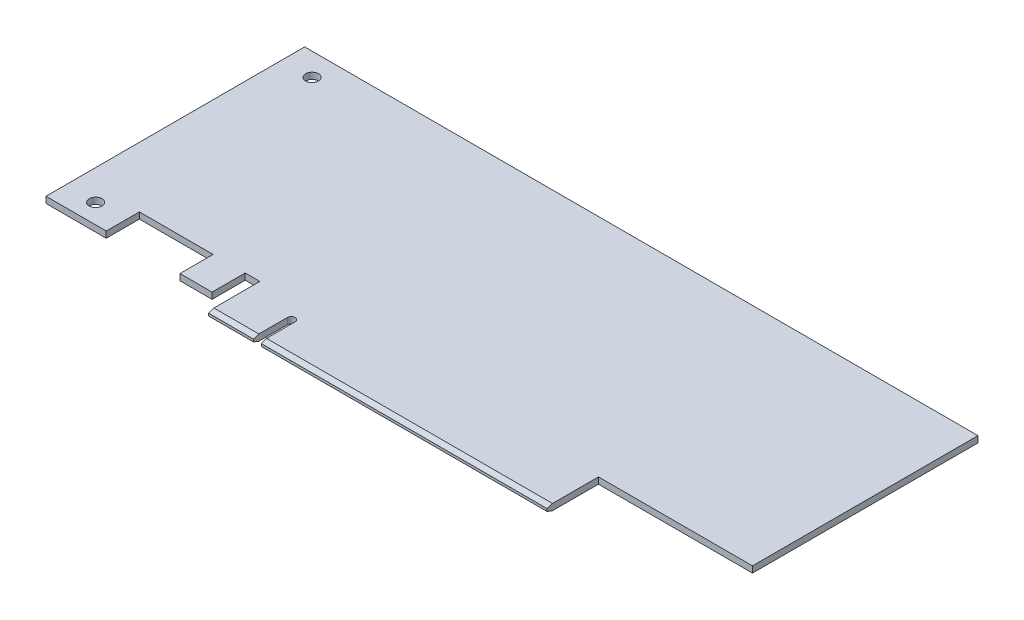
ISO-10303-21;
HEADER;
FILE_DESCRIPTION(('STEP AP214'),'2;1');
FILE_NAME('part.step','',(''),(''),'','','');
FILE_SCHEMA(('AUTOMOTIVE_DESIGN { 1 0 10303 214 1 1 1 1 }'));
ENDSEC;
DATA;
#1=APPLICATION_CONTEXT('core data for automotive mechanical design processes');
#2=APPLICATION_PROTOCOL_DEFINITION('international standard','automotive_design',2000,#1);
#3=PRODUCT_CONTEXT('',#1,'mechanical');
#4=PRODUCT('Part','Part','',(#3));
#5=PRODUCT_RELATED_PRODUCT_CATEGORY('part','',(#4));
#6=PRODUCT_DEFINITION_FORMATION('','',#4);
#7=PRODUCT_DEFINITION_CONTEXT('part definition',#1,'design');
#8=PRODUCT_DEFINITION('design','',#6,#7);
#9=PRODUCT_DEFINITION_SHAPE('','',#8);
#10=(LENGTH_UNIT() NAMED_UNIT(*) SI_UNIT(.MILLI.,.METRE.));
#11=(NAMED_UNIT(*) PLANE_ANGLE_UNIT() SI_UNIT($,.RADIAN.));
#12=(NAMED_UNIT(*) SI_UNIT($,.STERADIAN.) SOLID_ANGLE_UNIT());
#13=UNCERTAINTY_MEASURE_WITH_UNIT(LENGTH_MEASURE(1.E-05),#10,'distance_accuracy_value','');
#14=(GEOMETRIC_REPRESENTATION_CONTEXT(3) GLOBAL_UNCERTAINTY_ASSIGNED_CONTEXT((#13)) GLOBAL_UNIT_ASSIGNED_CONTEXT((#10,
#11,#12)) REPRESENTATION_CONTEXT('',''));
#15=CARTESIAN_POINT('',(0.,0.,0.));
#16=DIRECTION('',(0.,0.,1.));
#17=DIRECTION('',(1.,0.,0.));
#18=AXIS2_PLACEMENT_3D('',#15,#16,#17);
#19=CARTESIAN_POINT('',(50.6,1.57,0.));
#20=DIRECTION('',(1.,0.,0.));
#21=DIRECTION('',(0.,0.,-1.));
#22=AXIS2_PLACEMENT_3D('',#19,#20,#21);
#23=PLANE('',#22);
#24=DIRECTION('',(0.,-0.342020143325663,0.939692620785911));
#25=VECTOR('',#24,1.);
#26=CARTESIAN_POINT('',(50.6,4.15722012898828,0.941671116446083));
#27=LINE('',#26,#25);
#28=CARTESIAN_POINT('',(50.6,1.57,8.05));
#29=VERTEX_POINT('',#28);
#30=CARTESIAN_POINT('',(50.6,1.09683869545395,9.35));
#31=VERTEX_POINT('',#30);
#32=EDGE_CURVE('E195',#29,#31,#27,.T.);
#33=ORIENTED_EDGE('',*,*,#32,.F.);
#34=DIRECTION('',(0.,0.,1.));
#35=VECTOR('',#34,1.);
#36=CARTESIAN_POINT('',(50.6,1.57,0.));
#37=LINE('',#36,#35);
#38=CARTESIAN_POINT('',(50.6,1.57,0.950000000000001));
#39=VERTEX_POINT('',#38);
#40=EDGE_CURVE('E246',#39,#29,#37,.T.);
#41=ORIENTED_EDGE('',*,*,#40,.F.);
#42=DIRECTION('',(0.,-1.,0.));
#43=VECTOR('',#42,1.);
#44=CARTESIAN_POINT('',(50.6,1.57,0.950000000000001));
#45=LINE('',#44,#43);
#46=CARTESIAN_POINT('',(50.6,0.,0.950000000000001));
#47=VERTEX_POINT('',#46);
#48=EDGE_CURVE('E223',#39,#47,#45,.T.);
#49=ORIENTED_EDGE('',*,*,#48,.T.);
#50=DIRECTION('',(0.,0.,1.));
#51=VECTOR('',#50,1.);
#52=CARTESIAN_POINT('',(50.6,0.,0.));
#53=LINE('',#52,#51);
#54=CARTESIAN_POINT('',(50.6,0.,8.05));
#55=VERTEX_POINT('',#54);
#56=EDGE_CURVE('E256',#47,#55,#53,.T.);
#57=ORIENTED_EDGE('',*,*,#56,.T.);
#58=DIRECTION('',(0.,-0.342020143325663,-0.939692620785911));
#59=VECTOR('',#58,1.);
#60=CARTESIAN_POINT('',(50.6,-2.40356501683669,1.44625939005001));
#61=LINE('',#60,#59);
#62=CARTESIAN_POINT('',(50.6,0.473161304546053,9.35));
#63=VERTEX_POINT('',#62);
#64=EDGE_CURVE('E510',#63,#55,#61,.T.);
#65=ORIENTED_EDGE('',*,*,#64,.F.);
#66=DIRECTION('',(0.,-1.,0.));
#67=VECTOR('',#66,1.);
#68=CARTESIAN_POINT('',(50.6,1.57,9.35));
#69=LINE('',#68,#67);
#70=EDGE_CURVE('E218',#31,#63,#69,.T.);
#71=ORIENTED_EDGE('',*,*,#70,.F.);
#72=EDGE_LOOP('',(#33,#41,#49,#57,#65,#71));
#73=FACE_BOUND('',#72,.T.);
#74=ADVANCED_FACE('F45',(#73),#23,.F.);
#75=CARTESIAN_POINT('',(0.,1.57,9.35));
#76=DIRECTION('',(0.,0.,-1.));
#77=DIRECTION('',(-1.,0.,0.));
#78=AXIS2_PLACEMENT_3D('',#75,#76,#77);
#79=PLANE('',#78);
#80=DIRECTION('',(1.,0.,0.));
#81=VECTOR('',#80,1.);
#82=CARTESIAN_POINT('',(37.23,1.09683869545395,9.35));
#83=LINE('',#82,#81);
#84=CARTESIAN_POINT('',(121.8,1.09683869545395,9.35));
#85=VERTEX_POINT('',#84);
#86=EDGE_CURVE('E192',#31,#85,#83,.T.);
#87=ORIENTED_EDGE('',*,*,#86,.F.);
#88=ORIENTED_EDGE('',*,*,#70,.T.);
#89=DIRECTION('',(1.,0.,0.));
#90=VECTOR('',#89,1.);
#91=CARTESIAN_POINT('',(37.23,0.473161304546053,9.35));
#92=LINE('',#91,#90);
#93=CARTESIAN_POINT('',(121.8,0.473161304546053,9.35));
#94=VERTEX_POINT('',#93);
#95=EDGE_CURVE('E216',#63,#94,#92,.T.);
#96=ORIENTED_EDGE('',*,*,#95,.T.);
#97=DIRECTION('',(0.,-1.,0.));
#98=VECTOR('',#97,1.);
#99=CARTESIAN_POINT('',(121.8,1.57,9.35));
#100=LINE('',#99,#98);
#101=EDGE_CURVE('E208',#85,#94,#100,.T.);
#102=ORIENTED_EDGE('',*,*,#101,.F.);
#103=EDGE_LOOP('',(#87,#88,#96,#102));
#104=FACE_BOUND('',#103,.T.);
#105=ADVANCED_FACE('F215',(#104),#79,.F.);
#106=CARTESIAN_POINT('',(121.8,1.57,0.));
#107=DIRECTION('',(1.,0.,0.));
#108=DIRECTION('',(0.,0.,-1.));
#109=AXIS2_PLACEMENT_3D('',#106,#107,#108);
#110=PLANE('',#109);
#111=DIRECTION('',(0.,0.,1.));
#112=VECTOR('',#111,1.);
#113=CARTESIAN_POINT('',(121.8,1.57,0.));
#114=LINE('',#113,#112);
#115=CARTESIAN_POINT('',(121.8,1.57,-3.4));
#116=VERTEX_POINT('',#115);
#117=CARTESIAN_POINT('',(121.8,1.57,8.05));
#118=VERTEX_POINT('',#117);
#119=EDGE_CURVE('E210',#116,#118,#114,.T.);
#120=ORIENTED_EDGE('',*,*,#119,.T.);
#121=DIRECTION('',(0.,-0.342020143325663,0.939692620785911));
#122=VECTOR('',#121,1.);
#123=CARTESIAN_POINT('',(121.8,3.97356501683669,1.44625939005001));
#124=LINE('',#123,#122);
#125=EDGE_CURVE('E68',#118,#85,#124,.T.);
#126=ORIENTED_EDGE('',*,*,#125,.T.);
#127=ORIENTED_EDGE('',*,*,#101,.T.);
#128=DIRECTION('',(0.,-0.342020143325663,-0.939692620785911));
#129=VECTOR('',#128,1.);
#130=CARTESIAN_POINT('',(121.8,-2.58722012898828,0.941671116446081));
#131=LINE('',#130,#129);
#132=CARTESIAN_POINT('',(121.8,0.,8.05));
#133=VERTEX_POINT('',#132);
#134=EDGE_CURVE('E503',#94,#133,#131,.T.);
#135=ORIENTED_EDGE('',*,*,#134,.T.);
#136=DIRECTION('',(0.,0.,1.));
#137=VECTOR('',#136,1.);
#138=CARTESIAN_POINT('',(121.8,0.,0.));
#139=LINE('',#138,#137);
#140=CARTESIAN_POINT('',(121.8,0.,-3.4));
#141=VERTEX_POINT('',#140);
#142=EDGE_CURVE('E328',#141,#133,#139,.T.);
#143=ORIENTED_EDGE('',*,*,#142,.F.);
#144=DIRECTION('',(0.,-1.,0.));
#145=VECTOR('',#144,1.);
#146=CARTESIAN_POINT('',(121.8,1.57,-3.4));
#147=LINE('',#146,#145);
#148=EDGE_CURVE('E219',#116,#141,#147,.T.);
#149=ORIENTED_EDGE('',*,*,#148,.F.);
#150=EDGE_LOOP('',(#120,#126,#127,#135,#143,#149));
#151=FACE_BOUND('',#150,.T.);
#152=ADVANCED_FACE('F206',(#151),#110,.T.);
#153=CARTESIAN_POINT('',(37.5,1.57,0.));
#154=DIRECTION('',(1.,0.,0.));
#155=DIRECTION('',(0.,0.,-1.));
#156=AXIS2_PLACEMENT_3D('',#153,#154,#155);
#157=PLANE('',#156);
#158=DIRECTION('',(0.,-0.342020143325663,0.939692620785911));
#159=VECTOR('',#158,1.);
#160=CARTESIAN_POINT('',(37.5,4.15722012898828,0.941671116446083));
#161=LINE('',#160,#159);
#162=CARTESIAN_POINT('',(37.5,1.57,8.05));
#163=VERTEX_POINT('',#162);
#164=CARTESIAN_POINT('',(37.5,1.09683869545395,9.35));
#165=VERTEX_POINT('',#164);
#166=EDGE_CURVE('E251',#163,#165,#161,.T.);
#167=ORIENTED_EDGE('',*,*,#166,.F.);
#168=DIRECTION('',(0.,0.,1.));
#169=VECTOR('',#168,1.);
#170=CARTESIAN_POINT('',(37.5,1.57,0.));
#171=LINE('',#170,#169);
#172=CARTESIAN_POINT('',(37.5,1.57,-3.4));
#173=VERTEX_POINT('',#172);
#174=EDGE_CURVE('E309',#173,#163,#171,.T.);
#175=ORIENTED_EDGE('',*,*,#174,.F.);
#176=DIRECTION('',(0.,-1.,0.));
#177=VECTOR('',#176,1.);
#178=CARTESIAN_POINT('',(37.5,1.57,-3.4));
#179=LINE('',#178,#177);
#180=CARTESIAN_POINT('',(37.5,0.,-3.4));
#181=VERTEX_POINT('',#180);
#182=EDGE_CURVE('E399',#173,#181,#179,.T.);
#183=ORIENTED_EDGE('',*,*,#182,.T.);
#184=DIRECTION('',(0.,0.,1.));
#185=VECTOR('',#184,1.);
#186=CARTESIAN_POINT('',(37.5,0.,0.));
#187=LINE('',#186,#185);
#188=CARTESIAN_POINT('',(37.5,0.,8.05));
#189=VERTEX_POINT('',#188);
#190=EDGE_CURVE('E374',#181,#189,#187,.T.);
#191=ORIENTED_EDGE('',*,*,#190,.T.);
#192=DIRECTION('',(0.,-0.342020143325663,-0.939692620785911));
#193=VECTOR('',#192,1.);
#194=CARTESIAN_POINT('',(37.5,-2.40356501683669,1.44625939005001));
#195=LINE('',#194,#193);
#196=CARTESIAN_POINT('',(37.5,0.473161304546053,9.35));
#197=VERTEX_POINT('',#196);
#198=EDGE_CURVE('E500',#197,#189,#195,.T.);
#199=ORIENTED_EDGE('',*,*,#198,.F.);
#200=DIRECTION('',(0.,-1.,0.));
#201=VECTOR('',#200,1.);
#202=CARTESIAN_POINT('',(37.5,1.57,9.35));
#203=LINE('',#202,#201);
#204=EDGE_CURVE('E395',#165,#197,#203,.T.);
#205=ORIENTED_EDGE('',*,*,#204,.F.);
#206=EDGE_LOOP('',(#167,#175,#183,#191,#199,#205));
#207=FACE_BOUND('',#206,.T.);
#208=ADVANCED_FACE('F487',(#207),#157,.F.);
#209=CARTESIAN_POINT('',(0.,1.57,9.35));
#210=DIRECTION('',(0.,0.,-1.));
#211=DIRECTION('',(-1.,0.,0.));
#212=AXIS2_PLACEMENT_3D('',#209,#210,#211);
#213=PLANE('',#212);
#214=CARTESIAN_POINT('',(48.7,1.09683869545395,9.35));
#215=VERTEX_POINT('',#214);
#216=EDGE_CURVE('E201',#165,#215,#83,.T.);
#217=ORIENTED_EDGE('',*,*,#216,.F.);
#218=ORIENTED_EDGE('',*,*,#204,.T.);
#219=CARTESIAN_POINT('',(48.7,0.473161304546053,9.35));
#220=VERTEX_POINT('',#219);
#221=EDGE_CURVE('E212',#197,#220,#92,.T.);
#222=ORIENTED_EDGE('',*,*,#221,.T.);
#223=DIRECTION('',(0.,-1.,0.));
#224=VECTOR('',#223,1.);
#225=CARTESIAN_POINT('',(48.7,1.57,9.35));
#226=LINE('',#225,#224);
#227=EDGE_CURVE('E391',#215,#220,#226,.T.);
#228=ORIENTED_EDGE('',*,*,#227,.F.);
#229=EDGE_LOOP('',(#217,#218,#222,#228));
#230=FACE_BOUND('',#229,.T.);
#231=ADVANCED_FACE('F495',(#230),#213,.F.);
#232=CARTESIAN_POINT('',(48.7,1.57,0.));
#233=DIRECTION('',(1.,0.,0.));
#234=DIRECTION('',(0.,0.,-1.));
#235=AXIS2_PLACEMENT_3D('',#232,#233,#234);
#236=PLANE('',#235);
#237=DIRECTION('',(0.,0.,1.));
#238=VECTOR('',#237,1.);
#239=CARTESIAN_POINT('',(48.7,1.57,0.));
#240=LINE('',#239,#238);
#241=CARTESIAN_POINT('',(48.7,1.57,0.949999999999999));
#242=VERTEX_POINT('',#241);
#243=CARTESIAN_POINT('',(48.7,1.57,8.05));
#244=VERTEX_POINT('',#243);
#245=EDGE_CURVE('E312',#242,#244,#240,.T.);
#246=ORIENTED_EDGE('',*,*,#245,.T.);
#247=DIRECTION('',(0.,-0.342020143325663,0.939692620785911));
#248=VECTOR('',#247,1.);
#249=CARTESIAN_POINT('',(48.7,4.15722012898828,0.941671116446083));
#250=LINE('',#249,#248);
#251=EDGE_CURVE('E61',#244,#215,#250,.T.);
#252=ORIENTED_EDGE('',*,*,#251,.T.);
#253=ORIENTED_EDGE('',*,*,#227,.T.);
#254=DIRECTION('',(0.,-0.342020143325663,-0.939692620785911));
#255=VECTOR('',#254,1.);
#256=CARTESIAN_POINT('',(48.7,-2.40356501683669,1.44625939005001));
#257=LINE('',#256,#255);
#258=CARTESIAN_POINT('',(48.7,0.,8.05));
#259=VERTEX_POINT('',#258);
#260=EDGE_CURVE('E498',#220,#259,#257,.T.);
#261=ORIENTED_EDGE('',*,*,#260,.T.);
#262=DIRECTION('',(0.,0.,1.));
#263=VECTOR('',#262,1.);
#264=CARTESIAN_POINT('',(48.7,0.,0.));
#265=LINE('',#264,#263);
#266=CARTESIAN_POINT('',(48.7,0.,0.949999999999999));
#267=VERTEX_POINT('',#266);
#268=EDGE_CURVE('E378',#267,#259,#265,.T.);
#269=ORIENTED_EDGE('',*,*,#268,.F.);
#270=DIRECTION('',(0.,-1.,0.));
#271=VECTOR('',#270,1.);
#272=CARTESIAN_POINT('',(48.7,1.57,0.949999999999999));
#273=LINE('',#272,#271);
#274=EDGE_CURVE('E323',#242,#267,#273,.T.);
#275=ORIENTED_EDGE('',*,*,#274,.F.);
#276=EDGE_LOOP('',(#246,#252,#253,#261,#269,#275));
#277=FACE_BOUND('',#276,.T.);
#278=ADVANCED_FACE('F514',(#277),#236,.T.);
#279=CARTESIAN_POINT('',(0.,1.57,0.));
#280=DIRECTION('',(0.,1.,0.));
#281=DIRECTION('',(0.,0.,1.));
#282=AXIS2_PLACEMENT_3D('',#279,#280,#281);
#283=PLANE('',#282);
#284=CARTESIAN_POINT('',(0.,1.57,-53.9));
#285=DIRECTION('',(0.,1.,0.));
#286=DIRECTION('',(0.,0.,1.));
#287=AXIS2_PLACEMENT_3D('',#284,#285,#286);
#288=CIRCLE('',#287,1.59);
#289=CARTESIAN_POINT('',(0.,1.57,-52.31));
#290=VERTEX_POINT('',#289);
#291=EDGE_CURVE('E316',#290,#290,#288,.T.);
#292=ORIENTED_EDGE('',*,*,#291,.F.);
#293=EDGE_LOOP('',(#292));
#294=FACE_BOUND('',#293,.T.);
#295=CARTESIAN_POINT('',(0.,1.57,0.));
#296=DIRECTION('',(0.,1.,0.));
#297=DIRECTION('',(0.,0.,1.));
#298=AXIS2_PLACEMENT_3D('',#295,#296,#297);
#299=CIRCLE('',#298,1.59);
#300=CARTESIAN_POINT('',(0.,1.57,1.59));
#301=VERTEX_POINT('',#300);
#302=EDGE_CURVE('E320',#301,#301,#299,.T.);
#303=ORIENTED_EDGE('',*,*,#302,.F.);
#304=EDGE_LOOP('',(#303));
#305=FACE_BOUND('',#304,.T.);
#306=ORIENTED_EDGE('',*,*,#174,.T.);
#307=DIRECTION('',(1.,0.,0.));
#308=VECTOR('',#307,1.);
#309=CARTESIAN_POINT('',(0.,1.57,8.05));
#310=LINE('',#309,#308);
#311=EDGE_CURVE('E12',#163,#244,#310,.T.);
#312=ORIENTED_EDGE('',*,*,#311,.T.);
#313=ORIENTED_EDGE('',*,*,#245,.F.);
#314=CARTESIAN_POINT('',(49.65,1.57,0.95));
#315=DIRECTION('',(0.,1.,0.));
#316=DIRECTION('',(0.,0.,1.));
#317=AXIS2_PLACEMENT_3D('',#314,#315,#316);
#318=CIRCLE('',#317,0.95);
#319=EDGE_CURVE('E261',#39,#242,#318,.T.);
#320=ORIENTED_EDGE('',*,*,#319,.F.);
#321=ORIENTED_EDGE('',*,*,#40,.T.);
#322=EDGE_CURVE('E49',#29,#118,#310,.T.);
#323=ORIENTED_EDGE('',*,*,#322,.T.);
#324=ORIENTED_EDGE('',*,*,#119,.F.);
#325=DIRECTION('',(1.,0.,0.));
#326=VECTOR('',#325,1.);
#327=CARTESIAN_POINT('',(0.,1.57,-3.4));
#328=LINE('',#327,#326);
#329=CARTESIAN_POINT('',(160.15,1.57,-3.4));
#330=VERTEX_POINT('',#329);
#331=EDGE_CURVE('E270',#116,#330,#328,.T.);
#332=ORIENTED_EDGE('',*,*,#331,.T.);
#333=DIRECTION('',(0.,0.,1.));
#334=VECTOR('',#333,1.);
#335=CARTESIAN_POINT('',(160.15,1.57,0.));
#336=LINE('',#335,#334);
#337=CARTESIAN_POINT('',(160.15,1.57,-59.55));
#338=VERTEX_POINT('',#337);
#339=EDGE_CURVE('E273',#338,#330,#336,.T.);
#340=ORIENTED_EDGE('',*,*,#339,.F.);
#341=DIRECTION('',(1.,0.,0.));
#342=VECTOR('',#341,1.);
#343=CARTESIAN_POINT('',(0.,1.57,-59.55));
#344=LINE('',#343,#342);
#345=CARTESIAN_POINT('',(-7.5,1.57,-59.55));
#346=VERTEX_POINT('',#345);
#347=EDGE_CURVE('E277',#346,#338,#344,.T.);
#348=ORIENTED_EDGE('',*,*,#347,.F.);
#349=DIRECTION('',(0.,0.,1.));
#350=VECTOR('',#349,1.);
#351=CARTESIAN_POINT('',(-7.49999999999999,1.57,0.));
#352=LINE('',#351,#350);
#353=CARTESIAN_POINT('',(-7.5,1.57,4.85));
#354=VERTEX_POINT('',#353);
#355=EDGE_CURVE('E281',#346,#354,#352,.T.);
#356=ORIENTED_EDGE('',*,*,#355,.T.);
#357=DIRECTION('',(1.,0.,0.));
#358=VECTOR('',#357,1.);
#359=CARTESIAN_POINT('',(0.,1.57,4.85));
#360=LINE('',#359,#358);
#361=CARTESIAN_POINT('',(7.5,1.57,4.85));
#362=VERTEX_POINT('',#361);
#363=EDGE_CURVE('E284',#354,#362,#360,.T.);
#364=ORIENTED_EDGE('',*,*,#363,.T.);
#365=DIRECTION('',(0.,0.,1.));
#366=VECTOR('',#365,1.);
#367=CARTESIAN_POINT('',(7.5,1.57,0.));
#368=LINE('',#367,#366);
#369=CARTESIAN_POINT('',(7.5,1.57,-3.4));
#370=VERTEX_POINT('',#369);
#371=EDGE_CURVE('E287',#370,#362,#368,.T.);
#372=ORIENTED_EDGE('',*,*,#371,.F.);
#373=DIRECTION('',(-1.,0.,0.));
#374=VECTOR('',#373,1.);
#375=CARTESIAN_POINT('',(0.,1.57,-3.4));
#376=LINE('',#375,#374);
#377=CARTESIAN_POINT('',(25.85,1.57,-3.4));
#378=VERTEX_POINT('',#377);
#379=EDGE_CURVE('E291',#378,#370,#376,.T.);
#380=ORIENTED_EDGE('',*,*,#379,.F.);
#381=DIRECTION('',(0.,0.,-1.));
#382=VECTOR('',#381,1.);
#383=CARTESIAN_POINT('',(25.85,1.57,0.));
#384=LINE('',#383,#382);
#385=CARTESIAN_POINT('',(25.85,1.57,4.85));
#386=VERTEX_POINT('',#385);
#387=EDGE_CURVE('E295',#386,#378,#384,.T.);
#388=ORIENTED_EDGE('',*,*,#387,.F.);
#389=DIRECTION('',(1.,0.,0.));
#390=VECTOR('',#389,1.);
#391=CARTESIAN_POINT('',(0.,1.57,4.85));
#392=LINE('',#391,#390);
#393=CARTESIAN_POINT('',(33.85,1.57,4.85));
#394=VERTEX_POINT('',#393);
#395=EDGE_CURVE('E299',#386,#394,#392,.T.);
#396=ORIENTED_EDGE('',*,*,#395,.T.);
#397=DIRECTION('',(0.,0.,-1.));
#398=VECTOR('',#397,1.);
#399=CARTESIAN_POINT('',(33.85,1.57,0.));
#400=LINE('',#399,#398);
#401=CARTESIAN_POINT('',(33.85,1.57,-3.4));
#402=VERTEX_POINT('',#401);
#403=EDGE_CURVE('E302',#394,#402,#400,.T.);
#404=ORIENTED_EDGE('',*,*,#403,.T.);
#405=DIRECTION('',(-1.,0.,0.));
#406=VECTOR('',#405,1.);
#407=CARTESIAN_POINT('',(0.,1.57,-3.4));
#408=LINE('',#407,#406);
#409=EDGE_CURVE('E305',#173,#402,#408,.T.);
#410=ORIENTED_EDGE('',*,*,#409,.F.);
#411=EDGE_LOOP('',(#306,#312,#313,#320,#321,#323,#324,#332,#340,#348,#356,#364,#372,#380,#388,
#396,#404,#410));
#412=FACE_BOUND('',#411,.T.);
#413=ADVANCED_FACE('F243',(#294,#305,#412),#283,.T.);
#414=CARTESIAN_POINT('',(0.,0.,0.));
#415=DIRECTION('',(0.,1.,0.));
#416=DIRECTION('',(0.,0.,1.));
#417=AXIS2_PLACEMENT_3D('',#414,#415,#416);
#418=PLANE('',#417);
#419=CARTESIAN_POINT('',(0.,0.,-53.9));
#420=DIRECTION('',(0.,1.,0.));
#421=DIRECTION('',(0.,0.,1.));
#422=AXIS2_PLACEMENT_3D('',#419,#420,#421);
#423=CIRCLE('',#422,1.59);
#424=CARTESIAN_POINT('',(0.,0.,-52.31));
#425=VERTEX_POINT('',#424);
#426=EDGE_CURVE('E382',#425,#425,#423,.T.);
#427=ORIENTED_EDGE('',*,*,#426,.T.);
#428=EDGE_LOOP('',(#427));
#429=FACE_BOUND('',#428,.T.);
#430=CARTESIAN_POINT('',(0.,0.,0.));
#431=DIRECTION('',(0.,1.,0.));
#432=DIRECTION('',(0.,0.,1.));
#433=AXIS2_PLACEMENT_3D('',#430,#431,#432);
#434=CIRCLE('',#433,1.59);
#435=CARTESIAN_POINT('',(0.,0.,1.59));
#436=VERTEX_POINT('',#435);
#437=EDGE_CURVE('E265',#436,#436,#434,.T.);
#438=ORIENTED_EDGE('',*,*,#437,.T.);
#439=EDGE_LOOP('',(#438));
#440=FACE_BOUND('',#439,.T.);
#441=DIRECTION('',(1.,0.,0.));
#442=VECTOR('',#441,1.);
#443=CARTESIAN_POINT('',(0.,0.,8.05));
#444=LINE('',#443,#442);
#445=EDGE_CURVE('E232',#189,#259,#444,.T.);
#446=ORIENTED_EDGE('',*,*,#445,.F.);
#447=ORIENTED_EDGE('',*,*,#190,.F.);
#448=DIRECTION('',(-1.,0.,0.));
#449=VECTOR('',#448,1.);
#450=CARTESIAN_POINT('',(0.,0.,-3.4));
#451=LINE('',#450,#449);
#452=CARTESIAN_POINT('',(33.85,0.,-3.4));
#453=VERTEX_POINT('',#452);
#454=EDGE_CURVE('E370',#181,#453,#451,.T.);
#455=ORIENTED_EDGE('',*,*,#454,.T.);
#456=DIRECTION('',(0.,0.,-1.));
#457=VECTOR('',#456,1.);
#458=CARTESIAN_POINT('',(33.85,0.,0.));
#459=LINE('',#458,#457);
#460=CARTESIAN_POINT('',(33.85,0.,4.85));
#461=VERTEX_POINT('',#460);
#462=EDGE_CURVE('E366',#461,#453,#459,.T.);
#463=ORIENTED_EDGE('',*,*,#462,.F.);
#464=DIRECTION('',(1.,0.,0.));
#465=VECTOR('',#464,1.);
#466=CARTESIAN_POINT('',(0.,0.,4.85));
#467=LINE('',#466,#465);
#468=CARTESIAN_POINT('',(25.85,0.,4.85));
#469=VERTEX_POINT('',#468);
#470=EDGE_CURVE('E363',#469,#461,#467,.T.);
#471=ORIENTED_EDGE('',*,*,#470,.F.);
#472=DIRECTION('',(0.,0.,-1.));
#473=VECTOR('',#472,1.);
#474=CARTESIAN_POINT('',(25.85,0.,0.));
#475=LINE('',#474,#473);
#476=CARTESIAN_POINT('',(25.85,0.,-3.4));
#477=VERTEX_POINT('',#476);
#478=EDGE_CURVE('E359',#469,#477,#475,.T.);
#479=ORIENTED_EDGE('',*,*,#478,.T.);
#480=DIRECTION('',(-1.,0.,0.));
#481=VECTOR('',#480,1.);
#482=CARTESIAN_POINT('',(0.,0.,-3.4));
#483=LINE('',#482,#481);
#484=CARTESIAN_POINT('',(7.5,0.,-3.4));
#485=VERTEX_POINT('',#484);
#486=EDGE_CURVE('E355',#477,#485,#483,.T.);
#487=ORIENTED_EDGE('',*,*,#486,.T.);
#488=DIRECTION('',(0.,0.,1.));
#489=VECTOR('',#488,1.);
#490=CARTESIAN_POINT('',(7.5,0.,0.));
#491=LINE('',#490,#489);
#492=CARTESIAN_POINT('',(7.5,0.,4.85));
#493=VERTEX_POINT('',#492);
#494=EDGE_CURVE('E351',#485,#493,#491,.T.);
#495=ORIENTED_EDGE('',*,*,#494,.T.);
#496=DIRECTION('',(1.,0.,0.));
#497=VECTOR('',#496,1.);
#498=CARTESIAN_POINT('',(0.,0.,4.85));
#499=LINE('',#498,#497);
#500=CARTESIAN_POINT('',(-7.5,0.,4.85));
#501=VERTEX_POINT('',#500);
#502=EDGE_CURVE('E347',#501,#493,#499,.T.);
#503=ORIENTED_EDGE('',*,*,#502,.F.);
#504=DIRECTION('',(0.,0.,1.));
#505=VECTOR('',#504,1.);
#506=CARTESIAN_POINT('',(-7.49999999999999,0.,0.));
#507=LINE('',#506,#505);
#508=CARTESIAN_POINT('',(-7.5,0.,-59.55));
#509=VERTEX_POINT('',#508);
#510=EDGE_CURVE('E344',#509,#501,#507,.T.);
#511=ORIENTED_EDGE('',*,*,#510,.F.);
#512=DIRECTION('',(1.,0.,0.));
#513=VECTOR('',#512,1.);
#514=CARTESIAN_POINT('',(0.,0.,-59.55));
#515=LINE('',#514,#513);
#516=CARTESIAN_POINT('',(160.15,0.,-59.55));
#517=VERTEX_POINT('',#516);
#518=EDGE_CURVE('E340',#509,#517,#515,.T.);
#519=ORIENTED_EDGE('',*,*,#518,.T.);
#520=DIRECTION('',(0.,0.,1.));
#521=VECTOR('',#520,1.);
#522=CARTESIAN_POINT('',(160.15,0.,0.));
#523=LINE('',#522,#521);
#524=CARTESIAN_POINT('',(160.15,0.,-3.4));
#525=VERTEX_POINT('',#524);
#526=EDGE_CURVE('E336',#517,#525,#523,.T.);
#527=ORIENTED_EDGE('',*,*,#526,.T.);
#528=DIRECTION('',(1.,0.,0.));
#529=VECTOR('',#528,1.);
#530=CARTESIAN_POINT('',(0.,0.,-3.4));
#531=LINE('',#530,#529);
#532=EDGE_CURVE('E332',#141,#525,#531,.T.);
#533=ORIENTED_EDGE('',*,*,#532,.F.);
#534=ORIENTED_EDGE('',*,*,#142,.T.);
#535=EDGE_CURVE('E230',#55,#133,#444,.T.);
#536=ORIENTED_EDGE('',*,*,#535,.F.);
#537=ORIENTED_EDGE('',*,*,#56,.F.);
#538=CARTESIAN_POINT('',(49.65,0.,0.95));
#539=DIRECTION('',(0.,1.,0.));
#540=DIRECTION('',(0.,0.,1.));
#541=AXIS2_PLACEMENT_3D('',#538,#539,#540);
#542=CIRCLE('',#541,0.95);
#543=EDGE_CURVE('E250',#47,#267,#542,.T.);
#544=ORIENTED_EDGE('',*,*,#543,.T.);
#545=ORIENTED_EDGE('',*,*,#268,.T.);
#546=EDGE_LOOP('',(#446,#447,#455,#463,#471,#479,#487,#495,#503,#511,#519,#527,#533,#534,#536,
#537,#544,#545));
#547=FACE_BOUND('',#546,.T.);
#548=ADVANCED_FACE('F442',(#429,#440,#547),#418,.F.);
#549=CARTESIAN_POINT('',(49.65,1.57,0.95));
#550=DIRECTION('',(0.,-1.,0.));
#551=DIRECTION('',(0.,0.,-1.));
#552=AXIS2_PLACEMENT_3D('',#549,#550,#551);
#553=CYLINDRICAL_SURFACE('',#552,0.95);
#554=ORIENTED_EDGE('',*,*,#543,.F.);
#555=ORIENTED_EDGE('',*,*,#48,.F.);
#556=ORIENTED_EDGE('',*,*,#319,.T.);
#557=ORIENTED_EDGE('',*,*,#274,.T.);
#558=EDGE_LOOP('',(#554,#555,#556,#557));
#559=FACE_BOUND('',#558,.T.);
#560=ADVANCED_FACE('F47',(#559),#553,.F.);
#561=CARTESIAN_POINT('',(0.,1.57,-3.4));
#562=DIRECTION('',(0.,0.,-1.));
#563=DIRECTION('',(-1.,0.,0.));
#564=AXIS2_PLACEMENT_3D('',#561,#562,#563);
#565=PLANE('',#564);
#566=ORIENTED_EDGE('',*,*,#532,.T.);
#567=DIRECTION('',(0.,-1.,0.));
#568=VECTOR('',#567,1.);
#569=CARTESIAN_POINT('',(160.15,1.57,-3.4));
#570=LINE('',#569,#568);
#571=EDGE_CURVE('E225',#330,#525,#570,.T.);
#572=ORIENTED_EDGE('',*,*,#571,.F.);
#573=ORIENTED_EDGE('',*,*,#331,.F.);
#574=ORIENTED_EDGE('',*,*,#148,.T.);
#575=EDGE_LOOP('',(#566,#572,#573,#574));
#576=FACE_BOUND('',#575,.T.);
#577=ADVANCED_FACE('F439',(#576),#565,.F.);
#578=CARTESIAN_POINT('',(160.15,1.57,0.));
#579=DIRECTION('',(1.,0.,0.));
#580=DIRECTION('',(0.,0.,-1.));
#581=AXIS2_PLACEMENT_3D('',#578,#579,#580);
#582=PLANE('',#581);
#583=ORIENTED_EDGE('',*,*,#526,.F.);
#584=DIRECTION('',(0.,-1.,0.));
#585=VECTOR('',#584,1.);
#586=CARTESIAN_POINT('',(160.15,1.57,-59.55));
#587=LINE('',#586,#585);
#588=EDGE_CURVE('E428',#338,#517,#587,.T.);
#589=ORIENTED_EDGE('',*,*,#588,.F.);
#590=ORIENTED_EDGE('',*,*,#339,.T.);
#591=ORIENTED_EDGE('',*,*,#571,.T.);
#592=EDGE_LOOP('',(#583,#589,#590,#591));
#593=FACE_BOUND('',#592,.T.);
#594=ADVANCED_FACE('F434',(#593),#582,.T.);
#595=CARTESIAN_POINT('',(0.,1.57,-59.55));
#596=DIRECTION('',(0.,0.,-1.));
#597=DIRECTION('',(-1.,0.,0.));
#598=AXIS2_PLACEMENT_3D('',#595,#596,#597);
#599=PLANE('',#598);
#600=ORIENTED_EDGE('',*,*,#518,.F.);
#601=DIRECTION('',(0.,-1.,0.));
#602=VECTOR('',#601,1.);
#603=CARTESIAN_POINT('',(-7.5,1.57,-59.55));
#604=LINE('',#603,#602);
#605=EDGE_CURVE('E425',#346,#509,#604,.T.);
#606=ORIENTED_EDGE('',*,*,#605,.F.);
#607=ORIENTED_EDGE('',*,*,#347,.T.);
#608=ORIENTED_EDGE('',*,*,#588,.T.);
#609=EDGE_LOOP('',(#600,#606,#607,#608));
#610=FACE_BOUND('',#609,.T.);
#611=ADVANCED_FACE('F447',(#610),#599,.T.);
#612=CARTESIAN_POINT('',(-7.49999999999999,1.57,0.));
#613=DIRECTION('',(1.,0.,0.));
#614=DIRECTION('',(0.,0.,-1.));
#615=AXIS2_PLACEMENT_3D('',#612,#613,#614);
#616=PLANE('',#615);
#617=ORIENTED_EDGE('',*,*,#510,.T.);
#618=DIRECTION('',(0.,-1.,0.));
#619=VECTOR('',#618,1.);
#620=CARTESIAN_POINT('',(-7.5,1.57,4.85));
#621=LINE('',#620,#619);
#622=EDGE_CURVE('E421',#354,#501,#621,.T.);
#623=ORIENTED_EDGE('',*,*,#622,.F.);
#624=ORIENTED_EDGE('',*,*,#355,.F.);
#625=ORIENTED_EDGE('',*,*,#605,.T.);
#626=EDGE_LOOP('',(#617,#623,#624,#625));
#627=FACE_BOUND('',#626,.T.);
#628=ADVANCED_FACE('F455',(#627),#616,.F.);
#629=CARTESIAN_POINT('',(0.,1.57,4.85));
#630=DIRECTION('',(0.,0.,-1.));
#631=DIRECTION('',(-1.,0.,0.));
#632=AXIS2_PLACEMENT_3D('',#629,#630,#631);
#633=PLANE('',#632);
#634=ORIENTED_EDGE('',*,*,#502,.T.);
#635=DIRECTION('',(0.,-1.,0.));
#636=VECTOR('',#635,1.);
#637=CARTESIAN_POINT('',(7.5,1.57,4.85));
#638=LINE('',#637,#636);
#639=EDGE_CURVE('E418',#362,#493,#638,.T.);
#640=ORIENTED_EDGE('',*,*,#639,.F.);
#641=ORIENTED_EDGE('',*,*,#363,.F.);
#642=ORIENTED_EDGE('',*,*,#622,.T.);
#643=EDGE_LOOP('',(#634,#640,#641,#642));
#644=FACE_BOUND('',#643,.T.);
#645=ADVANCED_FACE('F457',(#644),#633,.F.);
#646=CARTESIAN_POINT('',(7.5,1.57,0.));
#647=DIRECTION('',(1.,0.,0.));
#648=DIRECTION('',(0.,0.,-1.));
#649=AXIS2_PLACEMENT_3D('',#646,#647,#648);
#650=PLANE('',#649);
#651=ORIENTED_EDGE('',*,*,#494,.F.);
#652=DIRECTION('',(0.,-1.,0.));
#653=VECTOR('',#652,1.);
#654=CARTESIAN_POINT('',(7.5,1.57,-3.4));
#655=LINE('',#654,#653);
#656=EDGE_CURVE('E415',#370,#485,#655,.T.);
#657=ORIENTED_EDGE('',*,*,#656,.F.);
#658=ORIENTED_EDGE('',*,*,#371,.T.);
#659=ORIENTED_EDGE('',*,*,#639,.T.);
#660=EDGE_LOOP('',(#651,#657,#658,#659));
#661=FACE_BOUND('',#660,.T.);
#662=ADVANCED_FACE('F460',(#661),#650,.T.);
#663=CARTESIAN_POINT('',(0.,1.57,-3.4));
#664=DIRECTION('',(0.,0.,1.));
#665=DIRECTION('',(1.,0.,0.));
#666=AXIS2_PLACEMENT_3D('',#663,#664,#665);
#667=PLANE('',#666);
#668=ORIENTED_EDGE('',*,*,#486,.F.);
#669=DIRECTION('',(0.,-1.,0.));
#670=VECTOR('',#669,1.);
#671=CARTESIAN_POINT('',(25.85,1.57,-3.4));
#672=LINE('',#671,#670);
#673=EDGE_CURVE('E412',#378,#477,#672,.T.);
#674=ORIENTED_EDGE('',*,*,#673,.F.);
#675=ORIENTED_EDGE('',*,*,#379,.T.);
#676=ORIENTED_EDGE('',*,*,#656,.T.);
#677=EDGE_LOOP('',(#668,#674,#675,#676));
#678=FACE_BOUND('',#677,.T.);
#679=ADVANCED_FACE('F465',(#678),#667,.T.);
#680=CARTESIAN_POINT('',(25.85,1.57,0.));
#681=DIRECTION('',(-1.,0.,0.));
#682=DIRECTION('',(0.,0.,1.));
#683=AXIS2_PLACEMENT_3D('',#680,#681,#682);
#684=PLANE('',#683);
#685=ORIENTED_EDGE('',*,*,#478,.F.);
#686=DIRECTION('',(0.,-1.,0.));
#687=VECTOR('',#686,1.);
#688=CARTESIAN_POINT('',(25.85,1.57,4.85));
#689=LINE('',#688,#687);
#690=EDGE_CURVE('E409',#386,#469,#689,.T.);
#691=ORIENTED_EDGE('',*,*,#690,.F.);
#692=ORIENTED_EDGE('',*,*,#387,.T.);
#693=ORIENTED_EDGE('',*,*,#673,.T.);
#694=EDGE_LOOP('',(#685,#691,#692,#693));
#695=FACE_BOUND('',#694,.T.);
#696=ADVANCED_FACE('F468',(#695),#684,.T.);
#697=CARTESIAN_POINT('',(0.,1.57,4.85));
#698=DIRECTION('',(0.,0.,-1.));
#699=DIRECTION('',(-1.,0.,0.));
#700=AXIS2_PLACEMENT_3D('',#697,#698,#699);
#701=PLANE('',#700);
#702=ORIENTED_EDGE('',*,*,#470,.T.);
#703=DIRECTION('',(0.,-1.,0.));
#704=VECTOR('',#703,1.);
#705=CARTESIAN_POINT('',(33.85,1.57,4.85));
#706=LINE('',#705,#704);
#707=EDGE_CURVE('E405',#394,#461,#706,.T.);
#708=ORIENTED_EDGE('',*,*,#707,.F.);
#709=ORIENTED_EDGE('',*,*,#395,.F.);
#710=ORIENTED_EDGE('',*,*,#690,.T.);
#711=EDGE_LOOP('',(#702,#708,#709,#710));
#712=FACE_BOUND('',#711,.T.);
#713=ADVANCED_FACE('F475',(#712),#701,.F.);
#714=CARTESIAN_POINT('',(33.85,1.57,0.));
#715=DIRECTION('',(-1.,0.,0.));
#716=DIRECTION('',(0.,0.,1.));
#717=AXIS2_PLACEMENT_3D('',#714,#715,#716);
#718=PLANE('',#717);
#719=ORIENTED_EDGE('',*,*,#462,.T.);
#720=DIRECTION('',(0.,-1.,0.));
#721=VECTOR('',#720,1.);
#722=CARTESIAN_POINT('',(33.85,1.57,-3.4));
#723=LINE('',#722,#721);
#724=EDGE_CURVE('E402',#402,#453,#723,.T.);
#725=ORIENTED_EDGE('',*,*,#724,.F.);
#726=ORIENTED_EDGE('',*,*,#403,.F.);
#727=ORIENTED_EDGE('',*,*,#707,.T.);
#728=EDGE_LOOP('',(#719,#725,#726,#727));
#729=FACE_BOUND('',#728,.T.);
#730=ADVANCED_FACE('F479',(#729),#718,.F.);
#731=CARTESIAN_POINT('',(0.,1.57,-3.4));
#732=DIRECTION('',(0.,0.,1.));
#733=DIRECTION('',(1.,0.,0.));
#734=AXIS2_PLACEMENT_3D('',#731,#732,#733);
#735=PLANE('',#734);
#736=ORIENTED_EDGE('',*,*,#454,.F.);
#737=ORIENTED_EDGE('',*,*,#182,.F.);
#738=ORIENTED_EDGE('',*,*,#409,.T.);
#739=ORIENTED_EDGE('',*,*,#724,.T.);
#740=EDGE_LOOP('',(#736,#737,#738,#739));
#741=FACE_BOUND('',#740,.T.);
#742=ADVANCED_FACE('F482',(#741),#735,.T.);
#743=CARTESIAN_POINT('',(0.,1.57,-53.9));
#744=DIRECTION('',(0.,-1.,0.));
#745=DIRECTION('',(0.,0.,-1.));
#746=AXIS2_PLACEMENT_3D('',#743,#744,#745);
#747=CYLINDRICAL_SURFACE('',#746,1.59);
#748=ORIENTED_EDGE('',*,*,#291,.T.);
#749=EDGE_LOOP('',(#748));
#750=FACE_BOUND('',#749,.T.);
#751=ORIENTED_EDGE('',*,*,#426,.F.);
#752=EDGE_LOOP('',(#751));
#753=FACE_BOUND('',#752,.T.);
#754=ADVANCED_FACE('F528',(#750,#753),#747,.F.);
#755=CARTESIAN_POINT('',(0.,1.57,0.));
#756=DIRECTION('',(0.,-1.,0.));
#757=DIRECTION('',(0.,0.,-1.));
#758=AXIS2_PLACEMENT_3D('',#755,#756,#757);
#759=CYLINDRICAL_SURFACE('',#758,1.59);
#760=ORIENTED_EDGE('',*,*,#302,.T.);
#761=EDGE_LOOP('',(#760));
#762=FACE_BOUND('',#761,.T.);
#763=ORIENTED_EDGE('',*,*,#437,.F.);
#764=EDGE_LOOP('',(#763));
#765=FACE_BOUND('',#764,.T.);
#766=ADVANCED_FACE('F522',(#762,#765),#759,.F.);
#767=CARTESIAN_POINT('',(37.23,-2.58722012898828,0.941671116446081));
#768=DIRECTION('',(0.,-0.93969262078591,0.342020143325663));
#769=DIRECTION('',(0.,-0.342020143325663,-0.939692620785911));
#770=AXIS2_PLACEMENT_3D('',#767,#768,#769);
#771=PLANE('',#770);
#772=ORIENTED_EDGE('',*,*,#64,.T.);
#773=ORIENTED_EDGE('',*,*,#535,.T.);
#774=ORIENTED_EDGE('',*,*,#134,.F.);
#775=ORIENTED_EDGE('',*,*,#95,.F.);
#776=EDGE_LOOP('',(#772,#773,#774,#775));
#777=FACE_BOUND('',#776,.T.);
#778=ADVANCED_FACE('F519',(#777),#771,.T.);
#779=ORIENTED_EDGE('',*,*,#198,.T.);
#780=ORIENTED_EDGE('',*,*,#445,.T.);
#781=ORIENTED_EDGE('',*,*,#260,.F.);
#782=ORIENTED_EDGE('',*,*,#221,.F.);
#783=EDGE_LOOP('',(#779,#780,#781,#782));
#784=FACE_BOUND('',#783,.T.);
#785=ADVANCED_FACE('F521',(#784),#771,.T.);
#786=CARTESIAN_POINT('',(37.23,3.97356501683669,1.44625939005001));
#787=DIRECTION('',(0.,0.939692620785911,0.342020143325663));
#788=DIRECTION('',(0.,-0.342020143325663,0.939692620785911));
#789=AXIS2_PLACEMENT_3D('',#786,#787,#788);
#790=PLANE('',#789);
#791=ORIENTED_EDGE('',*,*,#32,.T.);
#792=ORIENTED_EDGE('',*,*,#86,.T.);
#793=ORIENTED_EDGE('',*,*,#125,.F.);
#794=ORIENTED_EDGE('',*,*,#322,.F.);
#795=EDGE_LOOP('',(#791,#792,#793,#794));
#796=FACE_BOUND('',#795,.T.);
#797=ADVANCED_FACE('F193',(#796),#790,.T.);
#798=ORIENTED_EDGE('',*,*,#166,.T.);
#799=ORIENTED_EDGE('',*,*,#216,.T.);
#800=ORIENTED_EDGE('',*,*,#251,.F.);
#801=ORIENTED_EDGE('',*,*,#311,.F.);
#802=EDGE_LOOP('',(#798,#799,#800,#801));
#803=FACE_BOUND('',#802,.T.);
#804=ADVANCED_FACE('F492',(#803),#790,.T.);
#805=CLOSED_SHELL('',(#74,#105,#152,#208,#231,#278,#413,#548,#560,#577,#594,#611,#628,#645,#662,
#679,#696,#713,#730,#742,#754,#766,#778,#785,#797,#804));
#806=MANIFOLD_SOLID_BREP('B2',#805);
#807=ADVANCED_BREP_SHAPE_REPRESENTATION('',(#18,#806),#14);
#808=SHAPE_DEFINITION_REPRESENTATION(#9,#807);
ENDSEC;
END-ISO-10303-21;
